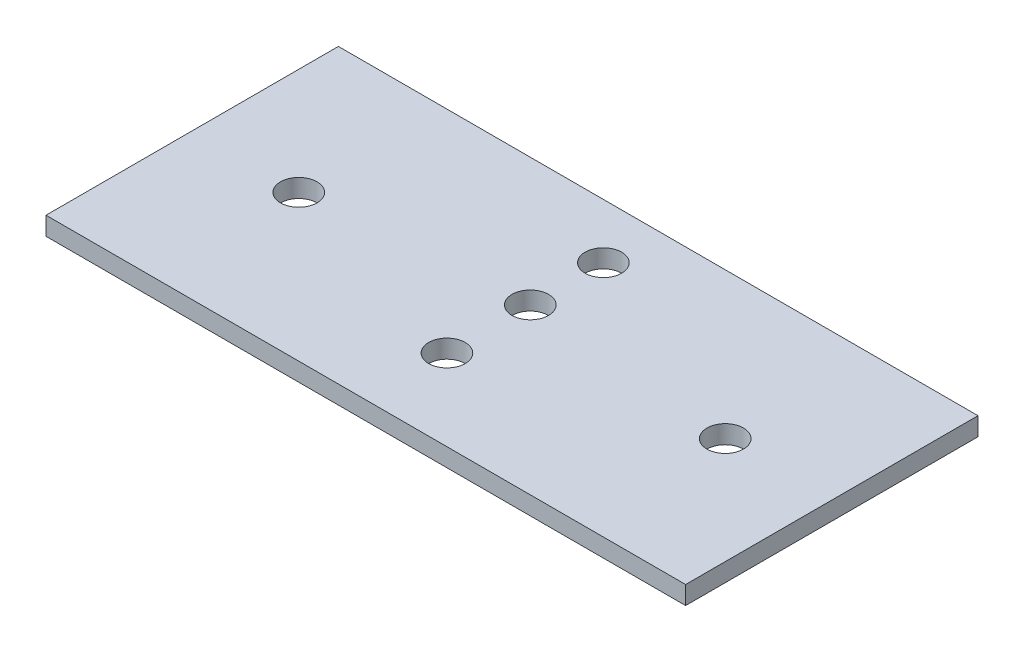
ISO-10303-21;
HEADER;
FILE_DESCRIPTION(('STEP AP214'),'2;1');
FILE_NAME('part.step','',(''),(''),'','','');
FILE_SCHEMA(('AUTOMOTIVE_DESIGN { 1 0 10303 214 1 1 1 1 }'));
ENDSEC;
DATA;
#1=APPLICATION_CONTEXT('core data for automotive mechanical design processes');
#2=APPLICATION_PROTOCOL_DEFINITION('international standard','automotive_design',2000,#1);
#3=PRODUCT_CONTEXT('',#1,'mechanical');
#4=PRODUCT('Part','Part','',(#3));
#5=PRODUCT_RELATED_PRODUCT_CATEGORY('part','',(#4));
#6=PRODUCT_DEFINITION_FORMATION('','',#4);
#7=PRODUCT_DEFINITION_CONTEXT('part definition',#1,'design');
#8=PRODUCT_DEFINITION('design','',#6,#7);
#9=PRODUCT_DEFINITION_SHAPE('','',#8);
#10=(LENGTH_UNIT() NAMED_UNIT(*) SI_UNIT(.MILLI.,.METRE.));
#11=(NAMED_UNIT(*) PLANE_ANGLE_UNIT() SI_UNIT($,.RADIAN.));
#12=(NAMED_UNIT(*) SI_UNIT($,.STERADIAN.) SOLID_ANGLE_UNIT());
#13=UNCERTAINTY_MEASURE_WITH_UNIT(LENGTH_MEASURE(1.E-05),#10,'distance_accuracy_value','');
#14=(GEOMETRIC_REPRESENTATION_CONTEXT(3) GLOBAL_UNCERTAINTY_ASSIGNED_CONTEXT((#13)) GLOBAL_UNIT_ASSIGNED_CONTEXT((#10,
#11,#12)) REPRESENTATION_CONTEXT('',''));
#15=CARTESIAN_POINT('',(0.,0.,0.));
#16=DIRECTION('',(0.,0.,1.));
#17=DIRECTION('',(1.,0.,0.));
#18=AXIS2_PLACEMENT_3D('',#15,#16,#17);
#19=CARTESIAN_POINT('',(-35.,0.,16.));
#20=DIRECTION('',(0.,0.,1.));
#21=DIRECTION('',(1.,0.,0.));
#22=AXIS2_PLACEMENT_3D('',#19,#20,#21);
#23=PLANE('',#22);
#24=DIRECTION('',(1.,0.,0.));
#25=VECTOR('',#24,1.);
#26=CARTESIAN_POINT('',(-35.,0.,16.));
#27=LINE('',#26,#25);
#28=CARTESIAN_POINT('',(-35.,0.,16.));
#29=VERTEX_POINT('',#28);
#30=CARTESIAN_POINT('',(35.,0.,16.));
#31=VERTEX_POINT('',#30);
#32=EDGE_CURVE('E46',#29,#31,#27,.T.);
#33=ORIENTED_EDGE('',*,*,#32,.T.);
#34=DIRECTION('',(0.,-1.,0.));
#35=VECTOR('',#34,1.);
#36=CARTESIAN_POINT('',(35.,0.,16.));
#37=LINE('',#36,#35);
#38=CARTESIAN_POINT('',(35.,2.,16.));
#39=VERTEX_POINT('',#38);
#40=EDGE_CURVE('E83',#39,#31,#37,.T.);
#41=ORIENTED_EDGE('',*,*,#40,.F.);
#42=DIRECTION('',(1.,0.,0.));
#43=VECTOR('',#42,1.);
#44=CARTESIAN_POINT('',(-35.,2.,16.));
#45=LINE('',#44,#43);
#46=CARTESIAN_POINT('',(-35.,2.,16.));
#47=VERTEX_POINT('',#46);
#48=EDGE_CURVE('E11',#47,#39,#45,.T.);
#49=ORIENTED_EDGE('',*,*,#48,.F.);
#50=DIRECTION('',(0.,-1.,0.));
#51=VECTOR('',#50,1.);
#52=CARTESIAN_POINT('',(-35.,0.,16.));
#53=LINE('',#52,#51);
#54=EDGE_CURVE('E84',#47,#29,#53,.T.);
#55=ORIENTED_EDGE('',*,*,#54,.T.);
#56=EDGE_LOOP('',(#33,#41,#49,#55));
#57=FACE_BOUND('',#56,.T.);
#58=ADVANCED_FACE('F43',(#57),#23,.T.);
#59=CARTESIAN_POINT('',(-35.,2.,16.));
#60=DIRECTION('',(0.,1.,0.));
#61=DIRECTION('',(0.,0.,1.));
#62=AXIS2_PLACEMENT_3D('',#59,#60,#61);
#63=PLANE('',#62);
#64=CARTESIAN_POINT('',(0.,2.,-10.));
#65=DIRECTION('',(0.,1.,0.));
#66=DIRECTION('',(0.,0.,1.));
#67=AXIS2_PLACEMENT_3D('',#64,#65,#66);
#68=CIRCLE('',#67,2.);
#69=CARTESIAN_POINT('',(0.,2.,-8.));
#70=VERTEX_POINT('',#69);
#71=EDGE_CURVE('E148',#70,#70,#68,.T.);
#72=ORIENTED_EDGE('',*,*,#71,.F.);
#73=EDGE_LOOP('',(#72));
#74=FACE_BOUND('',#73,.T.);
#75=CARTESIAN_POINT('',(0.,2.,-2.));
#76=DIRECTION('',(0.,1.,0.));
#77=DIRECTION('',(0.,0.,1.));
#78=AXIS2_PLACEMENT_3D('',#75,#76,#77);
#79=CIRCLE('',#78,2.);
#80=CARTESIAN_POINT('',(0.,2.,0.));
#81=VERTEX_POINT('',#80);
#82=EDGE_CURVE('E152',#81,#81,#79,.T.);
#83=ORIENTED_EDGE('',*,*,#82,.F.);
#84=EDGE_LOOP('',(#83));
#85=FACE_BOUND('',#84,.T.);
#86=CARTESIAN_POINT('',(0.,2.,7.12));
#87=DIRECTION('',(0.,1.,0.));
#88=DIRECTION('',(0.,0.,1.));
#89=AXIS2_PLACEMENT_3D('',#86,#87,#88);
#90=CIRCLE('',#89,2.);
#91=CARTESIAN_POINT('',(0.,2.,9.12));
#92=VERTEX_POINT('',#91);
#93=EDGE_CURVE('E156',#92,#92,#90,.T.);
#94=ORIENTED_EDGE('',*,*,#93,.F.);
#95=EDGE_LOOP('',(#94));
#96=FACE_BOUND('',#95,.T.);
#97=CARTESIAN_POINT('',(-23.335,2.,0.));
#98=DIRECTION('',(0.,1.,0.));
#99=DIRECTION('',(0.,0.,1.));
#100=AXIS2_PLACEMENT_3D('',#97,#98,#99);
#101=CIRCLE('',#100,2.);
#102=CARTESIAN_POINT('',(-23.335,2.,2.00000000000001));
#103=VERTEX_POINT('',#102);
#104=EDGE_CURVE('E104',#103,#103,#101,.T.);
#105=ORIENTED_EDGE('',*,*,#104,.F.);
#106=EDGE_LOOP('',(#105));
#107=FACE_BOUND('',#106,.T.);
#108=CARTESIAN_POINT('',(23.335,2.,0.));
#109=DIRECTION('',(0.,1.,0.));
#110=DIRECTION('',(0.,0.,1.));
#111=AXIS2_PLACEMENT_3D('',#108,#109,#110);
#112=CIRCLE('',#111,2.);
#113=CARTESIAN_POINT('',(23.335,2.,2.));
#114=VERTEX_POINT('',#113);
#115=EDGE_CURVE('E107',#114,#114,#112,.T.);
#116=ORIENTED_EDGE('',*,*,#115,.F.);
#117=EDGE_LOOP('',(#116));
#118=FACE_BOUND('',#117,.T.);
#119=ORIENTED_EDGE('',*,*,#48,.T.);
#120=DIRECTION('',(0.,0.,1.));
#121=VECTOR('',#120,1.);
#122=CARTESIAN_POINT('',(35.,2.,16.));
#123=LINE('',#122,#121);
#124=CARTESIAN_POINT('',(35.,2.00000000000001,-16.));
#125=VERTEX_POINT('',#124);
#126=EDGE_CURVE('E100',#125,#39,#123,.T.);
#127=ORIENTED_EDGE('',*,*,#126,.F.);
#128=DIRECTION('',(1.,0.,0.));
#129=VECTOR('',#128,1.);
#130=CARTESIAN_POINT('',(-35.,2.00000000000001,-16.));
#131=LINE('',#130,#129);
#132=CARTESIAN_POINT('',(-35.,2.00000000000001,-16.));
#133=VERTEX_POINT('',#132);
#134=EDGE_CURVE('E51',#133,#125,#131,.T.);
#135=ORIENTED_EDGE('',*,*,#134,.F.);
#136=DIRECTION('',(0.,0.,1.));
#137=VECTOR('',#136,1.);
#138=CARTESIAN_POINT('',(-35.,2.,16.));
#139=LINE('',#138,#137);
#140=EDGE_CURVE('E89',#133,#47,#139,.T.);
#141=ORIENTED_EDGE('',*,*,#140,.T.);
#142=EDGE_LOOP('',(#119,#127,#135,#141));
#143=FACE_BOUND('',#142,.T.);
#144=ADVANCED_FACE('F122',(#74,#85,#96,#107,#118,#143),#63,.T.);
#145=CARTESIAN_POINT('',(-35.,2.00000000000001,-16.));
#146=DIRECTION('',(0.,0.,-1.));
#147=DIRECTION('',(-1.,0.,0.));
#148=AXIS2_PLACEMENT_3D('',#145,#146,#147);
#149=PLANE('',#148);
#150=ORIENTED_EDGE('',*,*,#134,.T.);
#151=DIRECTION('',(0.,1.,0.));
#152=VECTOR('',#151,1.);
#153=CARTESIAN_POINT('',(35.,2.00000000000001,-16.));
#154=LINE('',#153,#152);
#155=CARTESIAN_POINT('',(35.,0.,-16.));
#156=VERTEX_POINT('',#155);
#157=EDGE_CURVE('E96',#156,#125,#154,.T.);
#158=ORIENTED_EDGE('',*,*,#157,.F.);
#159=DIRECTION('',(1.,0.,0.));
#160=VECTOR('',#159,1.);
#161=CARTESIAN_POINT('',(-35.,0.,-16.));
#162=LINE('',#161,#160);
#163=CARTESIAN_POINT('',(-35.,0.,-16.));
#164=VERTEX_POINT('',#163);
#165=EDGE_CURVE('E88',#164,#156,#162,.T.);
#166=ORIENTED_EDGE('',*,*,#165,.F.);
#167=DIRECTION('',(0.,1.,0.));
#168=VECTOR('',#167,1.);
#169=CARTESIAN_POINT('',(-35.,2.00000000000001,-16.));
#170=LINE('',#169,#168);
#171=EDGE_CURVE('E115',#164,#133,#170,.T.);
#172=ORIENTED_EDGE('',*,*,#171,.T.);
#173=EDGE_LOOP('',(#150,#158,#166,#172));
#174=FACE_BOUND('',#173,.T.);
#175=ADVANCED_FACE('F119',(#174),#149,.T.);
#176=CARTESIAN_POINT('',(-35.,0.,16.));
#177=DIRECTION('',(0.,-1.,0.));
#178=DIRECTION('',(0.,0.,-1.));
#179=AXIS2_PLACEMENT_3D('',#176,#177,#178);
#180=PLANE('',#179);
#181=CARTESIAN_POINT('',(0.,0.,-10.));
#182=DIRECTION('',(0.,-1.,0.));
#183=DIRECTION('',(0.,0.,-1.));
#184=AXIS2_PLACEMENT_3D('',#181,#182,#183);
#185=CIRCLE('',#184,2.);
#186=CARTESIAN_POINT('',(0.,0.,-8.));
#187=VERTEX_POINT('',#186);
#188=EDGE_CURVE('E166',#187,#187,#185,.F.);
#189=ORIENTED_EDGE('',*,*,#188,.T.);
#190=EDGE_LOOP('',(#189));
#191=FACE_BOUND('',#190,.T.);
#192=CARTESIAN_POINT('',(0.,0.,-2.));
#193=DIRECTION('',(0.,-1.,0.));
#194=DIRECTION('',(0.,0.,-1.));
#195=AXIS2_PLACEMENT_3D('',#192,#193,#194);
#196=CIRCLE('',#195,2.);
#197=CARTESIAN_POINT('',(0.,0.,0.));
#198=VERTEX_POINT('',#197);
#199=EDGE_CURVE('E173',#198,#198,#196,.F.);
#200=ORIENTED_EDGE('',*,*,#199,.T.);
#201=EDGE_LOOP('',(#200));
#202=FACE_BOUND('',#201,.T.);
#203=CARTESIAN_POINT('',(0.,0.,7.12));
#204=DIRECTION('',(0.,-1.,0.));
#205=DIRECTION('',(0.,0.,-1.));
#206=AXIS2_PLACEMENT_3D('',#203,#204,#205);
#207=CIRCLE('',#206,2.);
#208=CARTESIAN_POINT('',(0.,0.,9.12));
#209=VERTEX_POINT('',#208);
#210=EDGE_CURVE('E174',#209,#209,#207,.F.);
#211=ORIENTED_EDGE('',*,*,#210,.T.);
#212=EDGE_LOOP('',(#211));
#213=FACE_BOUND('',#212,.T.);
#214=CARTESIAN_POINT('',(-23.335,0.,0.));
#215=DIRECTION('',(0.,-1.,0.));
#216=DIRECTION('',(0.,0.,-1.));
#217=AXIS2_PLACEMENT_3D('',#214,#215,#216);
#218=CIRCLE('',#217,2.);
#219=CARTESIAN_POINT('',(-23.335,0.,2.00000000000001));
#220=VERTEX_POINT('',#219);
#221=EDGE_CURVE('E101',#220,#220,#218,.F.);
#222=ORIENTED_EDGE('',*,*,#221,.T.);
#223=EDGE_LOOP('',(#222));
#224=FACE_BOUND('',#223,.T.);
#225=CARTESIAN_POINT('',(23.335,0.,0.));
#226=DIRECTION('',(0.,-1.,0.));
#227=DIRECTION('',(0.,0.,-1.));
#228=AXIS2_PLACEMENT_3D('',#225,#226,#227);
#229=CIRCLE('',#228,2.);
#230=CARTESIAN_POINT('',(23.335,0.,2.));
#231=VERTEX_POINT('',#230);
#232=EDGE_CURVE('E163',#231,#231,#229,.F.);
#233=ORIENTED_EDGE('',*,*,#232,.T.);
#234=EDGE_LOOP('',(#233));
#235=FACE_BOUND('',#234,.T.);
#236=ORIENTED_EDGE('',*,*,#165,.T.);
#237=DIRECTION('',(0.,0.,-1.));
#238=VECTOR('',#237,1.);
#239=CARTESIAN_POINT('',(35.,0.,16.));
#240=LINE('',#239,#238);
#241=EDGE_CURVE('E91',#31,#156,#240,.T.);
#242=ORIENTED_EDGE('',*,*,#241,.F.);
#243=ORIENTED_EDGE('',*,*,#32,.F.);
#244=DIRECTION('',(0.,0.,-1.));
#245=VECTOR('',#244,1.);
#246=CARTESIAN_POINT('',(-35.,0.,16.));
#247=LINE('',#246,#245);
#248=EDGE_CURVE('E113',#29,#164,#247,.T.);
#249=ORIENTED_EDGE('',*,*,#248,.T.);
#250=EDGE_LOOP('',(#236,#242,#243,#249));
#251=FACE_BOUND('',#250,.T.);
#252=ADVANCED_FACE('F92',(#191,#202,#213,#224,#235,#251),#180,.T.);
#253=CARTESIAN_POINT('',(-35.,0.,0.));
#254=DIRECTION('',(-1.,0.,0.));
#255=DIRECTION('',(0.,0.,1.));
#256=AXIS2_PLACEMENT_3D('',#253,#254,#255);
#257=PLANE('',#256);
#258=ORIENTED_EDGE('',*,*,#54,.F.);
#259=ORIENTED_EDGE('',*,*,#140,.F.);
#260=ORIENTED_EDGE('',*,*,#171,.F.);
#261=ORIENTED_EDGE('',*,*,#248,.F.);
#262=EDGE_LOOP('',(#258,#259,#260,#261));
#263=FACE_BOUND('',#262,.T.);
#264=ADVANCED_FACE('F124',(#263),#257,.T.);
#265=CARTESIAN_POINT('',(35.,0.,0.));
#266=DIRECTION('',(-1.,0.,0.));
#267=DIRECTION('',(0.,0.,1.));
#268=AXIS2_PLACEMENT_3D('',#265,#266,#267);
#269=PLANE('',#268);
#270=ORIENTED_EDGE('',*,*,#40,.T.);
#271=ORIENTED_EDGE('',*,*,#241,.T.);
#272=ORIENTED_EDGE('',*,*,#157,.T.);
#273=ORIENTED_EDGE('',*,*,#126,.T.);
#274=EDGE_LOOP('',(#270,#271,#272,#273));
#275=FACE_BOUND('',#274,.T.);
#276=ADVANCED_FACE('F99',(#275),#269,.F.);
#277=CARTESIAN_POINT('',(23.335,-5.65685424949238,0.));
#278=DIRECTION('',(0.,1.,0.));
#279=DIRECTION('',(0.,0.,1.));
#280=AXIS2_PLACEMENT_3D('',#277,#278,#279);
#281=CYLINDRICAL_SURFACE('',#280,2.);
#282=CARTESIAN_POINT('',(23.335,2.,2.));
#283=CARTESIAN_POINT('',(23.335,1.97916666666667,2.));
#284=CARTESIAN_POINT('',(23.335,1.95833333333334,2.));
#285=CARTESIAN_POINT('',(23.335,1.91666666666667,2.));
#286=CARTESIAN_POINT('',(23.335,1.89583333333334,2.));
#287=CARTESIAN_POINT('',(23.335,1.85416666666667,2.));
#288=CARTESIAN_POINT('',(23.335,1.83333333333334,2.));
#289=CARTESIAN_POINT('',(23.335,1.79166666666667,2.));
#290=CARTESIAN_POINT('',(23.335,1.77083333333334,2.));
#291=CARTESIAN_POINT('',(23.335,1.72916666666667,2.));
#292=CARTESIAN_POINT('',(23.335,1.70833333333334,2.));
#293=CARTESIAN_POINT('',(23.335,1.66666666666667,2.));
#294=CARTESIAN_POINT('',(23.335,1.64583333333334,2.));
#295=CARTESIAN_POINT('',(23.335,1.60416666666667,2.));
#296=CARTESIAN_POINT('',(23.335,1.58333333333334,2.));
#297=CARTESIAN_POINT('',(23.335,1.54166666666667,2.));
#298=CARTESIAN_POINT('',(23.335,1.52083333333334,2.));
#299=CARTESIAN_POINT('',(23.335,1.47916666666667,2.));
#300=CARTESIAN_POINT('',(23.335,1.45833333333334,2.));
#301=CARTESIAN_POINT('',(23.335,1.41666666666667,2.));
#302=CARTESIAN_POINT('',(23.335,1.39583333333334,2.));
#303=CARTESIAN_POINT('',(23.335,1.35416666666667,2.));
#304=CARTESIAN_POINT('',(23.335,1.33333333333334,2.));
#305=CARTESIAN_POINT('',(23.335,1.29166666666667,2.));
#306=CARTESIAN_POINT('',(23.335,1.27083333333334,2.));
#307=CARTESIAN_POINT('',(23.335,1.22916666666667,2.));
#308=CARTESIAN_POINT('',(23.335,1.20833333333334,2.));
#309=CARTESIAN_POINT('',(23.335,1.16666666666667,2.));
#310=CARTESIAN_POINT('',(23.335,1.14583333333334,2.));
#311=CARTESIAN_POINT('',(23.335,1.10416666666667,2.));
#312=CARTESIAN_POINT('',(23.335,1.08333333333334,2.));
#313=CARTESIAN_POINT('',(23.335,1.04166666666667,2.));
#314=CARTESIAN_POINT('',(23.335,1.02083333333334,2.));
#315=CARTESIAN_POINT('',(23.335,0.979166666666669,2.));
#316=CARTESIAN_POINT('',(23.335,0.958333333333336,2.));
#317=CARTESIAN_POINT('',(23.335,0.916666666666669,2.));
#318=CARTESIAN_POINT('',(23.335,0.895833333333336,2.));
#319=CARTESIAN_POINT('',(23.335,0.854166666666669,2.));
#320=CARTESIAN_POINT('',(23.335,0.833333333333336,2.));
#321=CARTESIAN_POINT('',(23.335,0.791666666666669,2.));
#322=CARTESIAN_POINT('',(23.335,0.770833333333336,2.));
#323=CARTESIAN_POINT('',(23.335,0.729166666666669,2.));
#324=CARTESIAN_POINT('',(23.335,0.708333333333336,2.));
#325=CARTESIAN_POINT('',(23.335,0.666666666666669,2.));
#326=CARTESIAN_POINT('',(23.335,0.645833333333336,2.));
#327=CARTESIAN_POINT('',(23.335,0.60416666666667,2.));
#328=CARTESIAN_POINT('',(23.335,0.583333333333336,2.));
#329=CARTESIAN_POINT('',(23.335,0.54166666666667,2.));
#330=CARTESIAN_POINT('',(23.335,0.520833333333336,2.));
#331=CARTESIAN_POINT('',(23.335,0.47916666666667,2.));
#332=CARTESIAN_POINT('',(23.335,0.458333333333336,2.));
#333=CARTESIAN_POINT('',(23.335,0.41666666666667,2.));
#334=CARTESIAN_POINT('',(23.335,0.395833333333336,2.));
#335=CARTESIAN_POINT('',(23.335,0.35416666666667,2.));
#336=CARTESIAN_POINT('',(23.335,0.333333333333336,2.));
#337=CARTESIAN_POINT('',(23.335,0.29166666666667,2.));
#338=CARTESIAN_POINT('',(23.335,0.270833333333336,2.));
#339=CARTESIAN_POINT('',(23.335,0.229166666666669,2.));
#340=CARTESIAN_POINT('',(23.335,0.208333333333336,2.));
#341=CARTESIAN_POINT('',(23.335,0.166666666666669,2.));
#342=CARTESIAN_POINT('',(23.335,0.145833333333336,2.));
#343=CARTESIAN_POINT('',(23.335,0.104166666666669,2.));
#344=CARTESIAN_POINT('',(23.335,0.083333333333336,2.));
#345=CARTESIAN_POINT('',(23.335,0.0416666666666693,2.));
#346=CARTESIAN_POINT('',(23.335,0.0208333333333359,2.));
#347=CARTESIAN_POINT('',(23.335,0.,2.));
#348=B_SPLINE_CURVE_WITH_KNOTS('',3,(#282,#283,#284,#285,#286,#287,#288,#289,#290,#291,#292,
#293,#294,#295,#296,#297,#298,#299,#300,#301,#302,#303,#304,#305,#306,#307,#308,#309,#310,#311,
#312,#313,#314,#315,#316,#317,#318,#319,#320,#321,#322,#323,#324,#325,#326,#327,#328,#329,#330,
#331,#332,#333,#334,#335,#336,#337,#338,#339,#340,#341,#342,#343,#344,#345,#346,#347),
.UNSPECIFIED.,.F.,.F.,(4,2,2,2,2,2,2,2,2,2,2,2,2,2,2,2,2,2,2,2,2,2,2,2,2,2,2,2,2,2,2,2,4),(0.,
0.0625000000000001,0.125,0.1875,0.25,0.3125,0.375,0.4375,0.5,0.5625,0.625,0.6875,0.75,0.8125,
0.875,0.9375,1.,1.0625,1.125,1.1875,1.25,1.3125,1.375,1.4375,1.5,1.5625,1.625,1.6875,1.75,
1.8125,1.875,1.9375,2.),.UNSPECIFIED.);
#349=EDGE_CURVE('BSEAM131',#114,#231,#348,.T.);
#350=ORIENTED_EDGE('',*,*,#115,.T.);
#351=ORIENTED_EDGE('',*,*,#232,.F.);
#352=ORIENTED_EDGE('',*,*,#349,.T.);
#353=ORIENTED_EDGE('',*,*,#349,.F.);
#354=EDGE_LOOP('',(#350,#352,#351,#353));
#355=FACE_BOUND('',#354,.T.);
#356=ADVANCED_FACE('F131',(#355),#281,.F.);
#357=CARTESIAN_POINT('',(-23.335,-5.65685424949238,0.));
#358=DIRECTION('',(0.,1.,0.));
#359=DIRECTION('',(0.,0.,1.));
#360=AXIS2_PLACEMENT_3D('',#357,#358,#359);
#361=CYLINDRICAL_SURFACE('',#360,2.);
#362=CARTESIAN_POINT('',(-23.335,2.,2.00000000000001));
#363=CARTESIAN_POINT('',(-23.335,1.97916666666667,2.00000000000001));
#364=CARTESIAN_POINT('',(-23.335,1.95833333333334,2.00000000000001));
#365=CARTESIAN_POINT('',(-23.335,1.91666666666667,2.00000000000001));
#366=CARTESIAN_POINT('',(-23.335,1.89583333333334,2.00000000000001));
#367=CARTESIAN_POINT('',(-23.335,1.85416666666667,2.00000000000001));
#368=CARTESIAN_POINT('',(-23.335,1.83333333333334,2.00000000000001));
#369=CARTESIAN_POINT('',(-23.335,1.79166666666667,2.00000000000001));
#370=CARTESIAN_POINT('',(-23.335,1.77083333333334,2.00000000000001));
#371=CARTESIAN_POINT('',(-23.335,1.72916666666667,2.00000000000001));
#372=CARTESIAN_POINT('',(-23.335,1.70833333333334,2.00000000000001));
#373=CARTESIAN_POINT('',(-23.335,1.66666666666667,2.00000000000001));
#374=CARTESIAN_POINT('',(-23.335,1.64583333333334,2.00000000000001));
#375=CARTESIAN_POINT('',(-23.335,1.60416666666667,2.00000000000001));
#376=CARTESIAN_POINT('',(-23.335,1.58333333333334,2.00000000000001));
#377=CARTESIAN_POINT('',(-23.335,1.54166666666667,2.00000000000001));
#378=CARTESIAN_POINT('',(-23.335,1.52083333333334,2.00000000000001));
#379=CARTESIAN_POINT('',(-23.335,1.47916666666667,2.00000000000001));
#380=CARTESIAN_POINT('',(-23.335,1.45833333333334,2.00000000000001));
#381=CARTESIAN_POINT('',(-23.335,1.41666666666667,2.00000000000001));
#382=CARTESIAN_POINT('',(-23.335,1.39583333333334,2.00000000000001));
#383=CARTESIAN_POINT('',(-23.335,1.35416666666667,2.00000000000001));
#384=CARTESIAN_POINT('',(-23.335,1.33333333333334,2.00000000000001));
#385=CARTESIAN_POINT('',(-23.335,1.29166666666667,2.00000000000001));
#386=CARTESIAN_POINT('',(-23.335,1.27083333333334,2.00000000000001));
#387=CARTESIAN_POINT('',(-23.335,1.22916666666667,2.00000000000001));
#388=CARTESIAN_POINT('',(-23.335,1.20833333333334,2.00000000000001));
#389=CARTESIAN_POINT('',(-23.335,1.16666666666667,2.00000000000001));
#390=CARTESIAN_POINT('',(-23.335,1.14583333333334,2.00000000000001));
#391=CARTESIAN_POINT('',(-23.335,1.10416666666667,2.00000000000001));
#392=CARTESIAN_POINT('',(-23.335,1.08333333333334,2.00000000000001));
#393=CARTESIAN_POINT('',(-23.335,1.04166666666667,2.00000000000001));
#394=CARTESIAN_POINT('',(-23.335,1.02083333333334,2.00000000000001));
#395=CARTESIAN_POINT('',(-23.335,0.979166666666669,2.00000000000001));
#396=CARTESIAN_POINT('',(-23.335,0.958333333333336,2.00000000000001));
#397=CARTESIAN_POINT('',(-23.335,0.916666666666669,2.00000000000001));
#398=CARTESIAN_POINT('',(-23.335,0.895833333333336,2.00000000000001));
#399=CARTESIAN_POINT('',(-23.335,0.854166666666669,2.00000000000001));
#400=CARTESIAN_POINT('',(-23.335,0.833333333333336,2.00000000000001));
#401=CARTESIAN_POINT('',(-23.335,0.791666666666669,2.00000000000001));
#402=CARTESIAN_POINT('',(-23.335,0.770833333333336,2.00000000000001));
#403=CARTESIAN_POINT('',(-23.335,0.729166666666669,2.00000000000001));
#404=CARTESIAN_POINT('',(-23.335,0.708333333333336,2.00000000000001));
#405=CARTESIAN_POINT('',(-23.335,0.666666666666669,2.00000000000001));
#406=CARTESIAN_POINT('',(-23.335,0.645833333333336,2.00000000000001));
#407=CARTESIAN_POINT('',(-23.335,0.60416666666667,2.00000000000001));
#408=CARTESIAN_POINT('',(-23.335,0.583333333333336,2.00000000000001));
#409=CARTESIAN_POINT('',(-23.335,0.54166666666667,2.00000000000001));
#410=CARTESIAN_POINT('',(-23.335,0.520833333333336,2.00000000000001));
#411=CARTESIAN_POINT('',(-23.335,0.47916666666667,2.00000000000001));
#412=CARTESIAN_POINT('',(-23.335,0.458333333333336,2.00000000000001));
#413=CARTESIAN_POINT('',(-23.335,0.41666666666667,2.00000000000001));
#414=CARTESIAN_POINT('',(-23.335,0.395833333333336,2.00000000000001));
#415=CARTESIAN_POINT('',(-23.335,0.35416666666667,2.00000000000001));
#416=CARTESIAN_POINT('',(-23.335,0.333333333333336,2.00000000000001));
#417=CARTESIAN_POINT('',(-23.335,0.29166666666667,2.00000000000001));
#418=CARTESIAN_POINT('',(-23.335,0.270833333333336,2.00000000000001));
#419=CARTESIAN_POINT('',(-23.335,0.229166666666669,2.00000000000001));
#420=CARTESIAN_POINT('',(-23.335,0.208333333333336,2.00000000000001));
#421=CARTESIAN_POINT('',(-23.335,0.166666666666669,2.00000000000001));
#422=CARTESIAN_POINT('',(-23.335,0.145833333333336,2.00000000000001));
#423=CARTESIAN_POINT('',(-23.335,0.104166666666669,2.00000000000001));
#424=CARTESIAN_POINT('',(-23.335,0.083333333333336,2.00000000000001));
#425=CARTESIAN_POINT('',(-23.335,0.0416666666666693,2.00000000000001));
#426=CARTESIAN_POINT('',(-23.335,0.0208333333333359,2.00000000000001));
#427=CARTESIAN_POINT('',(-23.335,0.,2.00000000000001));
#428=B_SPLINE_CURVE_WITH_KNOTS('',3,(#362,#363,#364,#365,#366,#367,#368,#369,#370,#371,#372,
#373,#374,#375,#376,#377,#378,#379,#380,#381,#382,#383,#384,#385,#386,#387,#388,#389,#390,#391,
#392,#393,#394,#395,#396,#397,#398,#399,#400,#401,#402,#403,#404,#405,#406,#407,#408,#409,#410,
#411,#412,#413,#414,#415,#416,#417,#418,#419,#420,#421,#422,#423,#424,#425,#426,#427),
.UNSPECIFIED.,.F.,.F.,(4,2,2,2,2,2,2,2,2,2,2,2,2,2,2,2,2,2,2,2,2,2,2,2,2,2,2,2,2,2,2,2,4),(0.,
0.0625000000000001,0.125,0.1875,0.25,0.3125,0.375,0.4375,0.5,0.5625,0.625,0.6875,0.75,0.8125,
0.875,0.9375,1.,1.0625,1.125,1.1875,1.25,1.3125,1.375,1.4375,1.5,1.5625,1.625,1.6875,1.75,
1.8125,1.875,1.9375,2.),.UNSPECIFIED.);
#429=EDGE_CURVE('BSEAM194',#103,#220,#428,.T.);
#430=ORIENTED_EDGE('',*,*,#104,.T.);
#431=ORIENTED_EDGE('',*,*,#221,.F.);
#432=ORIENTED_EDGE('',*,*,#429,.T.);
#433=ORIENTED_EDGE('',*,*,#429,.F.);
#434=EDGE_LOOP('',(#430,#432,#431,#433));
#435=FACE_BOUND('',#434,.T.);
#436=ADVANCED_FACE('F194',(#435),#361,.F.);
#437=CARTESIAN_POINT('',(0.,-5.65685424949238,7.12));
#438=DIRECTION('',(0.,1.,0.));
#439=DIRECTION('',(0.,0.,1.));
#440=AXIS2_PLACEMENT_3D('',#437,#438,#439);
#441=CYLINDRICAL_SURFACE('',#440,2.);
#442=CARTESIAN_POINT('',(0.,2.,9.12));
#443=CARTESIAN_POINT('',(0.,1.97916666666667,9.12));
#444=CARTESIAN_POINT('',(0.,1.95833333333333,9.12));
#445=CARTESIAN_POINT('',(0.,1.91666666666667,9.12));
#446=CARTESIAN_POINT('',(0.,1.89583333333333,9.12));
#447=CARTESIAN_POINT('',(0.,1.85416666666667,9.12));
#448=CARTESIAN_POINT('',(0.,1.83333333333333,9.12));
#449=CARTESIAN_POINT('',(0.,1.79166666666667,9.12));
#450=CARTESIAN_POINT('',(0.,1.77083333333333,9.12));
#451=CARTESIAN_POINT('',(0.,1.72916666666667,9.12));
#452=CARTESIAN_POINT('',(0.,1.70833333333333,9.12));
#453=CARTESIAN_POINT('',(0.,1.66666666666667,9.12));
#454=CARTESIAN_POINT('',(0.,1.64583333333333,9.12));
#455=CARTESIAN_POINT('',(0.,1.60416666666667,9.12));
#456=CARTESIAN_POINT('',(0.,1.58333333333333,9.12));
#457=CARTESIAN_POINT('',(0.,1.54166666666667,9.12));
#458=CARTESIAN_POINT('',(0.,1.52083333333333,9.12));
#459=CARTESIAN_POINT('',(0.,1.47916666666667,9.12));
#460=CARTESIAN_POINT('',(0.,1.45833333333333,9.12));
#461=CARTESIAN_POINT('',(0.,1.41666666666667,9.12));
#462=CARTESIAN_POINT('',(0.,1.39583333333333,9.12));
#463=CARTESIAN_POINT('',(0.,1.35416666666667,9.12));
#464=CARTESIAN_POINT('',(0.,1.33333333333333,9.12));
#465=CARTESIAN_POINT('',(0.,1.29166666666667,9.12));
#466=CARTESIAN_POINT('',(0.,1.27083333333333,9.12));
#467=CARTESIAN_POINT('',(0.,1.22916666666667,9.12));
#468=CARTESIAN_POINT('',(0.,1.20833333333333,9.12));
#469=CARTESIAN_POINT('',(0.,1.16666666666667,9.12));
#470=CARTESIAN_POINT('',(0.,1.14583333333333,9.12));
#471=CARTESIAN_POINT('',(0.,1.10416666666667,9.12));
#472=CARTESIAN_POINT('',(0.,1.08333333333333,9.12));
#473=CARTESIAN_POINT('',(0.,1.04166666666667,9.12));
#474=CARTESIAN_POINT('',(0.,1.02083333333333,9.12));
#475=CARTESIAN_POINT('',(0.,0.979166666666668,9.12));
#476=CARTESIAN_POINT('',(0.,0.958333333333334,9.12));
#477=CARTESIAN_POINT('',(0.,0.916666666666668,9.12));
#478=CARTESIAN_POINT('',(0.,0.895833333333334,9.12));
#479=CARTESIAN_POINT('',(0.,0.854166666666667,9.12));
#480=CARTESIAN_POINT('',(0.,0.833333333333334,9.12));
#481=CARTESIAN_POINT('',(0.,0.791666666666667,9.12));
#482=CARTESIAN_POINT('',(0.,0.770833333333334,9.12));
#483=CARTESIAN_POINT('',(0.,0.729166666666667,9.12));
#484=CARTESIAN_POINT('',(0.,0.708333333333334,9.12));
#485=CARTESIAN_POINT('',(0.,0.666666666666668,9.12));
#486=CARTESIAN_POINT('',(0.,0.645833333333334,9.12));
#487=CARTESIAN_POINT('',(0.,0.604166666666668,9.12));
#488=CARTESIAN_POINT('',(0.,0.583333333333335,9.12));
#489=CARTESIAN_POINT('',(0.,0.541666666666668,9.12));
#490=CARTESIAN_POINT('',(0.,0.520833333333335,9.12));
#491=CARTESIAN_POINT('',(0.,0.479166666666668,9.12));
#492=CARTESIAN_POINT('',(0.,0.458333333333335,9.12));
#493=CARTESIAN_POINT('',(0.,0.416666666666668,9.12));
#494=CARTESIAN_POINT('',(0.,0.395833333333335,9.12));
#495=CARTESIAN_POINT('',(0.,0.354166666666668,9.12));
#496=CARTESIAN_POINT('',(0.,0.333333333333335,9.12));
#497=CARTESIAN_POINT('',(0.,0.291666666666668,9.12));
#498=CARTESIAN_POINT('',(0.,0.270833333333334,9.12));
#499=CARTESIAN_POINT('',(0.,0.229166666666668,9.12));
#500=CARTESIAN_POINT('',(0.,0.208333333333334,9.12));
#501=CARTESIAN_POINT('',(0.,0.166666666666668,9.12));
#502=CARTESIAN_POINT('',(0.,0.145833333333334,9.12));
#503=CARTESIAN_POINT('',(0.,0.104166666666668,9.12));
#504=CARTESIAN_POINT('',(0.,0.0833333333333343,9.12));
#505=CARTESIAN_POINT('',(0.,0.0416666666666676,9.12));
#506=CARTESIAN_POINT('',(0.,0.0208333333333342,9.12));
#507=CARTESIAN_POINT('',(0.,0.,9.12));
#508=B_SPLINE_CURVE_WITH_KNOTS('',3,(#442,#443,#444,#445,#446,#447,#448,#449,#450,#451,#452,
#453,#454,#455,#456,#457,#458,#459,#460,#461,#462,#463,#464,#465,#466,#467,#468,#469,#470,#471,
#472,#473,#474,#475,#476,#477,#478,#479,#480,#481,#482,#483,#484,#485,#486,#487,#488,#489,#490,
#491,#492,#493,#494,#495,#496,#497,#498,#499,#500,#501,#502,#503,#504,#505,#506,#507),
.UNSPECIFIED.,.F.,.F.,(4,2,2,2,2,2,2,2,2,2,2,2,2,2,2,2,2,2,2,2,2,2,2,2,2,2,2,2,2,2,2,2,4),(0.,
0.0625000000000001,0.125,0.1875,0.25,0.3125,0.375,0.4375,0.5,0.5625,0.625,0.6875,0.75,0.8125,
0.875,0.9375,1.,1.0625,1.125,1.1875,1.25,1.3125,1.375,1.4375,1.5,1.5625,1.625,1.6875,1.75,
1.8125,1.875,1.9375,2.),.UNSPECIFIED.);
#509=EDGE_CURVE('BSEAM195',#92,#209,#508,.T.);
#510=ORIENTED_EDGE('',*,*,#93,.T.);
#511=ORIENTED_EDGE('',*,*,#210,.F.);
#512=ORIENTED_EDGE('',*,*,#509,.T.);
#513=ORIENTED_EDGE('',*,*,#509,.F.);
#514=EDGE_LOOP('',(#510,#512,#511,#513));
#515=FACE_BOUND('',#514,.T.);
#516=ADVANCED_FACE('F195',(#515),#441,.F.);
#517=CARTESIAN_POINT('',(0.,-5.65685424949238,-2.));
#518=DIRECTION('',(0.,1.,0.));
#519=DIRECTION('',(0.,0.,1.));
#520=AXIS2_PLACEMENT_3D('',#517,#518,#519);
#521=CYLINDRICAL_SURFACE('',#520,2.);
#522=CARTESIAN_POINT('',(0.,2.,0.));
#523=CARTESIAN_POINT('',(0.,1.97916666666667,0.));
#524=CARTESIAN_POINT('',(0.,1.95833333333334,0.));
#525=CARTESIAN_POINT('',(0.,1.91666666666667,0.));
#526=CARTESIAN_POINT('',(0.,1.89583333333334,0.));
#527=CARTESIAN_POINT('',(0.,1.85416666666667,0.));
#528=CARTESIAN_POINT('',(0.,1.83333333333334,0.));
#529=CARTESIAN_POINT('',(0.,1.79166666666667,0.));
#530=CARTESIAN_POINT('',(0.,1.77083333333334,0.));
#531=CARTESIAN_POINT('',(0.,1.72916666666667,0.));
#532=CARTESIAN_POINT('',(0.,1.70833333333334,0.));
#533=CARTESIAN_POINT('',(0.,1.66666666666667,0.));
#534=CARTESIAN_POINT('',(0.,1.64583333333334,0.));
#535=CARTESIAN_POINT('',(0.,1.60416666666667,0.));
#536=CARTESIAN_POINT('',(0.,1.58333333333334,0.));
#537=CARTESIAN_POINT('',(0.,1.54166666666667,0.));
#538=CARTESIAN_POINT('',(0.,1.52083333333334,0.));
#539=CARTESIAN_POINT('',(0.,1.47916666666667,0.));
#540=CARTESIAN_POINT('',(0.,1.45833333333334,0.));
#541=CARTESIAN_POINT('',(0.,1.41666666666667,0.));
#542=CARTESIAN_POINT('',(0.,1.39583333333334,0.));
#543=CARTESIAN_POINT('',(0.,1.35416666666667,0.));
#544=CARTESIAN_POINT('',(0.,1.33333333333334,0.));
#545=CARTESIAN_POINT('',(0.,1.29166666666667,0.));
#546=CARTESIAN_POINT('',(0.,1.27083333333334,0.));
#547=CARTESIAN_POINT('',(0.,1.22916666666667,0.));
#548=CARTESIAN_POINT('',(0.,1.20833333333334,0.));
#549=CARTESIAN_POINT('',(0.,1.16666666666667,0.));
#550=CARTESIAN_POINT('',(0.,1.14583333333334,0.));
#551=CARTESIAN_POINT('',(0.,1.10416666666667,0.));
#552=CARTESIAN_POINT('',(0.,1.08333333333334,0.));
#553=CARTESIAN_POINT('',(0.,1.04166666666667,0.));
#554=CARTESIAN_POINT('',(0.,1.02083333333334,0.));
#555=CARTESIAN_POINT('',(0.,0.979166666666669,0.));
#556=CARTESIAN_POINT('',(0.,0.958333333333336,0.));
#557=CARTESIAN_POINT('',(0.,0.916666666666669,0.));
#558=CARTESIAN_POINT('',(0.,0.895833333333336,0.));
#559=CARTESIAN_POINT('',(0.,0.854166666666669,0.));
#560=CARTESIAN_POINT('',(0.,0.833333333333336,0.));
#561=CARTESIAN_POINT('',(0.,0.791666666666669,0.));
#562=CARTESIAN_POINT('',(0.,0.770833333333336,0.));
#563=CARTESIAN_POINT('',(0.,0.729166666666669,0.));
#564=CARTESIAN_POINT('',(0.,0.708333333333336,0.));
#565=CARTESIAN_POINT('',(0.,0.666666666666669,0.));
#566=CARTESIAN_POINT('',(0.,0.645833333333336,0.));
#567=CARTESIAN_POINT('',(0.,0.60416666666667,0.));
#568=CARTESIAN_POINT('',(0.,0.583333333333336,0.));
#569=CARTESIAN_POINT('',(0.,0.54166666666667,0.));
#570=CARTESIAN_POINT('',(0.,0.520833333333336,0.));
#571=CARTESIAN_POINT('',(0.,0.47916666666667,0.));
#572=CARTESIAN_POINT('',(0.,0.458333333333336,0.));
#573=CARTESIAN_POINT('',(0.,0.41666666666667,0.));
#574=CARTESIAN_POINT('',(0.,0.395833333333336,0.));
#575=CARTESIAN_POINT('',(0.,0.35416666666667,0.));
#576=CARTESIAN_POINT('',(0.,0.333333333333336,0.));
#577=CARTESIAN_POINT('',(0.,0.29166666666667,0.));
#578=CARTESIAN_POINT('',(0.,0.270833333333336,0.));
#579=CARTESIAN_POINT('',(0.,0.229166666666669,0.));
#580=CARTESIAN_POINT('',(0.,0.208333333333336,0.));
#581=CARTESIAN_POINT('',(0.,0.166666666666669,0.));
#582=CARTESIAN_POINT('',(0.,0.145833333333336,0.));
#583=CARTESIAN_POINT('',(0.,0.104166666666669,0.));
#584=CARTESIAN_POINT('',(0.,0.083333333333336,0.));
#585=CARTESIAN_POINT('',(0.,0.0416666666666693,0.));
#586=CARTESIAN_POINT('',(0.,0.0208333333333359,0.));
#587=CARTESIAN_POINT('',(0.,0.,0.));
#588=B_SPLINE_CURVE_WITH_KNOTS('',3,(#522,#523,#524,#525,#526,#527,#528,#529,#530,#531,#532,
#533,#534,#535,#536,#537,#538,#539,#540,#541,#542,#543,#544,#545,#546,#547,#548,#549,#550,#551,
#552,#553,#554,#555,#556,#557,#558,#559,#560,#561,#562,#563,#564,#565,#566,#567,#568,#569,#570,
#571,#572,#573,#574,#575,#576,#577,#578,#579,#580,#581,#582,#583,#584,#585,#586,#587),
.UNSPECIFIED.,.F.,.F.,(4,2,2,2,2,2,2,2,2,2,2,2,2,2,2,2,2,2,2,2,2,2,2,2,2,2,2,2,2,2,2,2,4),(0.,
0.0625000000000001,0.125,0.1875,0.25,0.3125,0.375,0.4375,0.5,0.5625,0.625,0.6875,0.75,0.8125,
0.875,0.9375,1.,1.0625,1.125,1.1875,1.25,1.3125,1.375,1.4375,1.5,1.5625,1.625,1.6875,1.75,
1.8125,1.875,1.9375,2.),.UNSPECIFIED.);
#589=EDGE_CURVE('BSEAM184',#81,#198,#588,.T.);
#590=ORIENTED_EDGE('',*,*,#82,.T.);
#591=ORIENTED_EDGE('',*,*,#199,.F.);
#592=ORIENTED_EDGE('',*,*,#589,.T.);
#593=ORIENTED_EDGE('',*,*,#589,.F.);
#594=EDGE_LOOP('',(#590,#592,#591,#593));
#595=FACE_BOUND('',#594,.T.);
#596=ADVANCED_FACE('F184',(#595),#521,.F.);
#597=CARTESIAN_POINT('',(0.,-5.65685424949238,-10.));
#598=DIRECTION('',(0.,1.,0.));
#599=DIRECTION('',(0.,0.,1.));
#600=AXIS2_PLACEMENT_3D('',#597,#598,#599);
#601=CYLINDRICAL_SURFACE('',#600,2.);
#602=CARTESIAN_POINT('',(0.,2.,-8.));
#603=CARTESIAN_POINT('',(0.,1.97916666666667,-8.));
#604=CARTESIAN_POINT('',(0.,1.95833333333334,-8.));
#605=CARTESIAN_POINT('',(0.,1.91666666666667,-8.));
#606=CARTESIAN_POINT('',(0.,1.89583333333334,-8.));
#607=CARTESIAN_POINT('',(0.,1.85416666666667,-8.));
#608=CARTESIAN_POINT('',(0.,1.83333333333334,-8.));
#609=CARTESIAN_POINT('',(0.,1.79166666666667,-8.));
#610=CARTESIAN_POINT('',(0.,1.77083333333334,-8.));
#611=CARTESIAN_POINT('',(0.,1.72916666666667,-8.));
#612=CARTESIAN_POINT('',(0.,1.70833333333334,-8.));
#613=CARTESIAN_POINT('',(0.,1.66666666666667,-8.));
#614=CARTESIAN_POINT('',(0.,1.64583333333334,-8.));
#615=CARTESIAN_POINT('',(0.,1.60416666666667,-8.));
#616=CARTESIAN_POINT('',(0.,1.58333333333334,-8.));
#617=CARTESIAN_POINT('',(0.,1.54166666666667,-8.));
#618=CARTESIAN_POINT('',(0.,1.52083333333334,-8.));
#619=CARTESIAN_POINT('',(0.,1.47916666666667,-8.));
#620=CARTESIAN_POINT('',(0.,1.45833333333334,-8.));
#621=CARTESIAN_POINT('',(0.,1.41666666666667,-8.));
#622=CARTESIAN_POINT('',(0.,1.39583333333334,-8.));
#623=CARTESIAN_POINT('',(0.,1.35416666666667,-8.));
#624=CARTESIAN_POINT('',(0.,1.33333333333334,-8.));
#625=CARTESIAN_POINT('',(0.,1.29166666666667,-8.));
#626=CARTESIAN_POINT('',(0.,1.27083333333334,-8.));
#627=CARTESIAN_POINT('',(0.,1.22916666666667,-8.));
#628=CARTESIAN_POINT('',(0.,1.20833333333334,-8.));
#629=CARTESIAN_POINT('',(0.,1.16666666666667,-8.));
#630=CARTESIAN_POINT('',(0.,1.14583333333334,-8.));
#631=CARTESIAN_POINT('',(0.,1.10416666666667,-8.));
#632=CARTESIAN_POINT('',(0.,1.08333333333334,-8.));
#633=CARTESIAN_POINT('',(0.,1.04166666666667,-8.));
#634=CARTESIAN_POINT('',(0.,1.02083333333334,-8.));
#635=CARTESIAN_POINT('',(0.,0.979166666666671,-8.));
#636=CARTESIAN_POINT('',(0.,0.958333333333338,-8.));
#637=CARTESIAN_POINT('',(0.,0.916666666666671,-8.));
#638=CARTESIAN_POINT('',(0.,0.895833333333338,-8.));
#639=CARTESIAN_POINT('',(0.,0.854166666666671,-8.));
#640=CARTESIAN_POINT('',(0.,0.833333333333337,-8.));
#641=CARTESIAN_POINT('',(0.,0.791666666666671,-8.));
#642=CARTESIAN_POINT('',(0.,0.770833333333337,-8.));
#643=CARTESIAN_POINT('',(0.,0.729166666666671,-8.));
#644=CARTESIAN_POINT('',(0.,0.708333333333337,-8.));
#645=CARTESIAN_POINT('',(0.,0.666666666666671,-8.));
#646=CARTESIAN_POINT('',(0.,0.645833333333338,-8.));
#647=CARTESIAN_POINT('',(0.,0.604166666666672,-8.));
#648=CARTESIAN_POINT('',(0.,0.583333333333338,-8.));
#649=CARTESIAN_POINT('',(0.,0.541666666666672,-8.));
#650=CARTESIAN_POINT('',(0.,0.520833333333338,-8.));
#651=CARTESIAN_POINT('',(0.,0.479166666666671,-8.));
#652=CARTESIAN_POINT('',(0.,0.458333333333338,-8.));
#653=CARTESIAN_POINT('',(0.,0.416666666666671,-8.));
#654=CARTESIAN_POINT('',(0.,0.395833333333338,-8.));
#655=CARTESIAN_POINT('',(0.,0.354166666666671,-8.));
#656=CARTESIAN_POINT('',(0.,0.333333333333338,-8.));
#657=CARTESIAN_POINT('',(0.,0.291666666666671,-8.));
#658=CARTESIAN_POINT('',(0.,0.270833333333338,-8.));
#659=CARTESIAN_POINT('',(0.,0.229166666666671,-8.));
#660=CARTESIAN_POINT('',(0.,0.208333333333338,-8.));
#661=CARTESIAN_POINT('',(0.,0.166666666666671,-8.));
#662=CARTESIAN_POINT('',(0.,0.145833333333338,-8.));
#663=CARTESIAN_POINT('',(0.,0.104166666666671,-8.));
#664=CARTESIAN_POINT('',(0.,0.0833333333333377,-8.));
#665=CARTESIAN_POINT('',(0.,0.041666666666671,-8.));
#666=CARTESIAN_POINT('',(0.,0.0208333333333377,-8.));
#667=CARTESIAN_POINT('',(0.,0.,-8.));
#668=B_SPLINE_CURVE_WITH_KNOTS('',3,(#602,#603,#604,#605,#606,#607,#608,#609,#610,#611,#612,
#613,#614,#615,#616,#617,#618,#619,#620,#621,#622,#623,#624,#625,#626,#627,#628,#629,#630,#631,
#632,#633,#634,#635,#636,#637,#638,#639,#640,#641,#642,#643,#644,#645,#646,#647,#648,#649,#650,
#651,#652,#653,#654,#655,#656,#657,#658,#659,#660,#661,#662,#663,#664,#665,#666,#667),
.UNSPECIFIED.,.F.,.F.,(4,2,2,2,2,2,2,2,2,2,2,2,2,2,2,2,2,2,2,2,2,2,2,2,2,2,2,2,2,2,2,2,4),(0.,
0.0625000000000001,0.125,0.1875,0.25,0.3125,0.375,0.4375,0.5,0.5625,0.625,0.6875,0.75,0.8125,
0.875,0.9375,1.,1.0625,1.125,1.1875,1.25,1.3125,1.375,1.4375,1.5,1.5625,1.625,1.6875,1.75,
1.8125,1.875,1.9375,2.),.UNSPECIFIED.);
#669=EDGE_CURVE('BSEAM181',#70,#187,#668,.T.);
#670=ORIENTED_EDGE('',*,*,#71,.T.);
#671=ORIENTED_EDGE('',*,*,#188,.F.);
#672=ORIENTED_EDGE('',*,*,#669,.T.);
#673=ORIENTED_EDGE('',*,*,#669,.F.);
#674=EDGE_LOOP('',(#670,#672,#671,#673));
#675=FACE_BOUND('',#674,.T.);
#676=ADVANCED_FACE('F181',(#675),#601,.F.);
#677=CLOSED_SHELL('',(#58,#144,#175,#252,#264,#276,#356,#436,#516,#596,#676));
#678=MANIFOLD_SOLID_BREP('B2',#677);
#679=ADVANCED_BREP_SHAPE_REPRESENTATION('',(#18,#678),#14);
#680=SHAPE_DEFINITION_REPRESENTATION(#9,#679);
ENDSEC;
END-ISO-10303-21;
